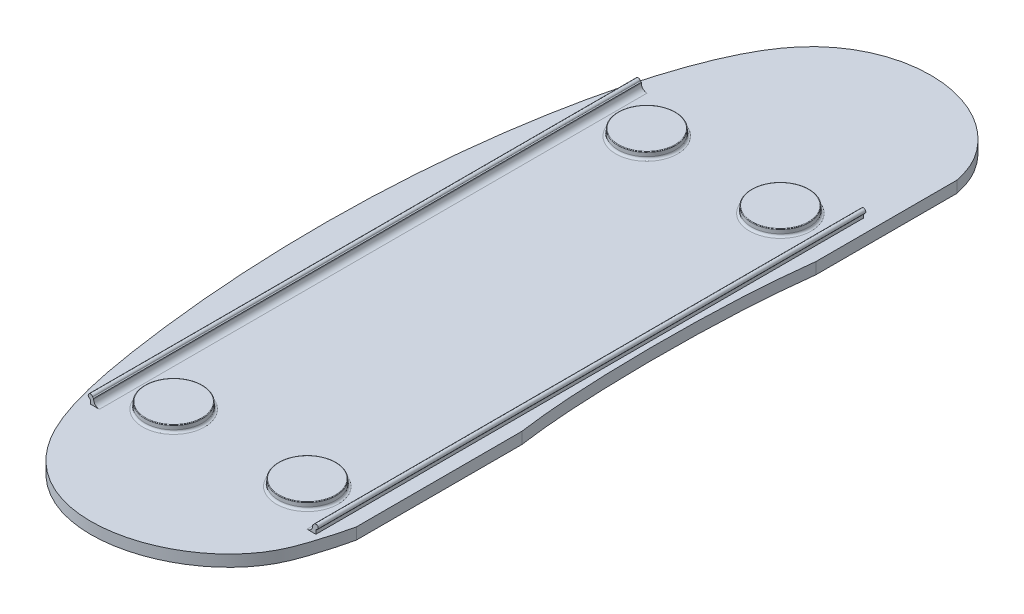
ISO-10303-21;
HEADER;
FILE_DESCRIPTION(('STEP AP214'),'2;1');
FILE_NAME('part.step','',(''),(''),'','','');
FILE_SCHEMA(('AUTOMOTIVE_DESIGN { 1 0 10303 214 1 1 1 1 }'));
ENDSEC;
DATA;
#1=APPLICATION_CONTEXT('core data for automotive mechanical design processes');
#2=APPLICATION_PROTOCOL_DEFINITION('international standard','automotive_design',2000,#1);
#3=PRODUCT_CONTEXT('',#1,'mechanical');
#4=PRODUCT('Part','Part','',(#3));
#5=PRODUCT_RELATED_PRODUCT_CATEGORY('part','',(#4));
#6=PRODUCT_DEFINITION_FORMATION('','',#4);
#7=PRODUCT_DEFINITION_CONTEXT('part definition',#1,'design');
#8=PRODUCT_DEFINITION('design','',#6,#7);
#9=PRODUCT_DEFINITION_SHAPE('','',#8);
#10=(LENGTH_UNIT() NAMED_UNIT(*) SI_UNIT(.MILLI.,.METRE.));
#11=(NAMED_UNIT(*) PLANE_ANGLE_UNIT() SI_UNIT($,.RADIAN.));
#12=(NAMED_UNIT(*) SI_UNIT($,.STERADIAN.) SOLID_ANGLE_UNIT());
#13=UNCERTAINTY_MEASURE_WITH_UNIT(LENGTH_MEASURE(1.E-05),#10,'distance_accuracy_value','');
#14=(GEOMETRIC_REPRESENTATION_CONTEXT(3) GLOBAL_UNCERTAINTY_ASSIGNED_CONTEXT((#13)) GLOBAL_UNIT_ASSIGNED_CONTEXT((#10,
#11,#12)) REPRESENTATION_CONTEXT('',''));
#15=CARTESIAN_POINT('',(0.,0.,0.));
#16=DIRECTION('',(0.,0.,1.));
#17=DIRECTION('',(1.,0.,0.));
#18=AXIS2_PLACEMENT_3D('',#15,#16,#17);
#19=CARTESIAN_POINT('',(-192.253506798672,1.15,-20.0821070412094));
#20=DIRECTION('',(1.,0.,0.));
#21=DIRECTION('',(0.,0.,-1.));
#22=AXIS2_PLACEMENT_3D('',#19,#20,#21);
#23=PLANE('',#22);
#24=DIRECTION('',(0.,1.,0.));
#25=VECTOR('',#24,1.);
#26=CARTESIAN_POINT('',(-192.253506798672,1.15,-19.5821070412094));
#27=LINE('',#26,#25);
#28=CARTESIAN_POINT('',(-192.253506798672,0.,-19.5821070412094));
#29=VERTEX_POINT('',#28);
#30=CARTESIAN_POINT('',(-192.253506798672,0.584314575050781,-19.5821070412094));
#31=VERTEX_POINT('',#30);
#32=EDGE_CURVE('E505',#29,#31,#27,.T.);
#33=ORIENTED_EDGE('',*,*,#32,.F.);
#34=DIRECTION('',(0.,0.,1.));
#35=VECTOR('',#34,1.);
#36=CARTESIAN_POINT('',(-192.253506798672,0.,-20.0821070412094));
#37=LINE('',#36,#35);
#38=CARTESIAN_POINT('',(-192.253506798672,0.,75.9178929587906));
#39=VERTEX_POINT('',#38);
#40=EDGE_CURVE('E266',#29,#39,#37,.T.);
#41=ORIENTED_EDGE('',*,*,#40,.T.);
#42=DIRECTION('',(0.,-1.,0.));
#43=VECTOR('',#42,1.);
#44=CARTESIAN_POINT('',(-192.253506798672,1.15,75.9178929587906));
#45=LINE('',#44,#43);
#46=CARTESIAN_POINT('',(-192.253506798672,0.584314575050781,75.9178929587906));
#47=VERTEX_POINT('',#46);
#48=EDGE_CURVE('E535',#47,#39,#45,.T.);
#49=ORIENTED_EDGE('',*,*,#48,.F.);
#50=DIRECTION('',(0.,0.,-1.));
#51=VECTOR('',#50,1.);
#52=CARTESIAN_POINT('',(-192.253506798672,0.584314575050781,-20.0821070412094));
#53=LINE('',#52,#51);
#54=EDGE_CURVE('E416',#47,#31,#53,.T.);
#55=ORIENTED_EDGE('',*,*,#54,.T.);
#56=EDGE_LOOP('',(#33,#41,#49,#55));
#57=FACE_BOUND('',#56,.T.);
#58=ADVANCED_FACE('F117',(#57),#23,.F.);
#59=CARTESIAN_POINT('',(-152.953506798672,1.15,-20.0821070412094));
#60=DIRECTION('',(-1.,0.,0.));
#61=DIRECTION('',(0.,0.,1.));
#62=AXIS2_PLACEMENT_3D('',#59,#60,#61);
#63=PLANE('',#62);
#64=DIRECTION('',(0.,-1.,0.));
#65=VECTOR('',#64,1.);
#66=CARTESIAN_POINT('',(-152.953506798672,1.15,-19.5821070412094));
#67=LINE('',#66,#65);
#68=CARTESIAN_POINT('',(-152.953506798672,0.584314575050752,-19.5821070412094));
#69=VERTEX_POINT('',#68);
#70=CARTESIAN_POINT('',(-152.953506798672,0.,-19.5821070412094));
#71=VERTEX_POINT('',#70);
#72=EDGE_CURVE('E519',#69,#71,#67,.T.);
#73=ORIENTED_EDGE('',*,*,#72,.F.);
#74=DIRECTION('',(0.,0.,1.));
#75=VECTOR('',#74,1.);
#76=CARTESIAN_POINT('',(-152.953506798672,0.584314575050752,76.4178929587906));
#77=LINE('',#76,#75);
#78=CARTESIAN_POINT('',(-152.953506798672,0.584314575050752,75.9178929587906));
#79=VERTEX_POINT('',#78);
#80=EDGE_CURVE('E258',#69,#79,#77,.T.);
#81=ORIENTED_EDGE('',*,*,#80,.T.);
#82=DIRECTION('',(0.,1.,0.));
#83=VECTOR('',#82,1.);
#84=CARTESIAN_POINT('',(-152.953506798672,1.15,75.9178929587906));
#85=LINE('',#84,#83);
#86=CARTESIAN_POINT('',(-152.953506798672,0.,75.9178929587906));
#87=VERTEX_POINT('',#86);
#88=EDGE_CURVE('E243',#87,#79,#85,.T.);
#89=ORIENTED_EDGE('',*,*,#88,.F.);
#90=DIRECTION('',(0.,0.,-1.));
#91=VECTOR('',#90,1.);
#92=CARTESIAN_POINT('',(-152.953506798672,0.,-20.0821070412094));
#93=LINE('',#92,#91);
#94=EDGE_CURVE('E256',#87,#71,#93,.T.);
#95=ORIENTED_EDGE('',*,*,#94,.T.);
#96=EDGE_LOOP('',(#73,#81,#89,#95));
#97=FACE_BOUND('',#96,.T.);
#98=ADVANCED_FACE('F255',(#97),#63,.F.);
#99=CARTESIAN_POINT('',(-191.703506798672,-103.785789007937,-20.0821070412094));
#100=DIRECTION('',(-1.,0.,0.));
#101=DIRECTION('',(0.,0.,1.));
#102=AXIS2_PLACEMENT_3D('',#99,#100,#101);
#103=PLANE('',#102);
#104=DIRECTION('',(0.,-1.,0.));
#105=VECTOR('',#104,1.);
#106=CARTESIAN_POINT('',(-191.703506798672,-103.785789007937,-19.5821070412094));
#107=LINE('',#106,#105);
#108=CARTESIAN_POINT('',(-191.703506798672,1.15,-19.5821070412094));
#109=VERTEX_POINT('',#108);
#110=CARTESIAN_POINT('',(-191.703506798672,1.,-19.5821070412094));
#111=VERTEX_POINT('',#110);
#112=EDGE_CURVE('E259',#109,#111,#107,.T.);
#113=ORIENTED_EDGE('',*,*,#112,.F.);
#114=DIRECTION('',(0.,0.,1.));
#115=VECTOR('',#114,1.);
#116=CARTESIAN_POINT('',(-191.703506798672,1.15,-20.0821070412094));
#117=LINE('',#116,#115);
#118=CARTESIAN_POINT('',(-191.703506798672,1.15,75.9178929587906));
#119=VERTEX_POINT('',#118);
#120=EDGE_CURVE('E489',#109,#119,#117,.T.);
#121=ORIENTED_EDGE('',*,*,#120,.T.);
#122=DIRECTION('',(0.,1.,0.));
#123=VECTOR('',#122,1.);
#124=CARTESIAN_POINT('',(-191.703506798672,-103.785789007937,75.9178929587906));
#125=LINE('',#124,#123);
#126=CARTESIAN_POINT('',(-191.703506798672,1.,75.9178929587906));
#127=VERTEX_POINT('',#126);
#128=EDGE_CURVE('E480',#127,#119,#125,.T.);
#129=ORIENTED_EDGE('',*,*,#128,.F.);
#130=DIRECTION('',(0.,0.,1.));
#131=VECTOR('',#130,1.);
#132=CARTESIAN_POINT('',(-191.703506798672,1.,-20.0821070412094));
#133=LINE('',#132,#131);
#134=EDGE_CURVE('E474',#127,#111,#133,.F.);
#135=ORIENTED_EDGE('',*,*,#134,.T.);
#136=EDGE_LOOP('',(#113,#121,#129,#135));
#137=FACE_BOUND('',#136,.T.);
#138=ADVANCED_FACE('F371',(#137),#103,.F.);
#139=CARTESIAN_POINT('',(-153.503506798672,-103.785789007937,-20.0821070412094));
#140=DIRECTION('',(-1.,0.,0.));
#141=DIRECTION('',(0.,0.,1.));
#142=AXIS2_PLACEMENT_3D('',#139,#140,#141);
#143=PLANE('',#142);
#144=DIRECTION('',(0.,0.,1.));
#145=VECTOR('',#144,1.);
#146=CARTESIAN_POINT('',(-153.503506798672,1.15,-20.0821070412094));
#147=LINE('',#146,#145);
#148=CARTESIAN_POINT('',(-153.503506798672,1.15,-19.5821070412094));
#149=VERTEX_POINT('',#148);
#150=CARTESIAN_POINT('',(-153.503506798672,1.15,75.9178929587906));
#151=VERTEX_POINT('',#150);
#152=EDGE_CURVE('E272',#149,#151,#147,.T.);
#153=ORIENTED_EDGE('',*,*,#152,.F.);
#154=DIRECTION('',(0.,-1.,0.));
#155=VECTOR('',#154,1.);
#156=CARTESIAN_POINT('',(-153.503506798672,-103.785789007937,-19.5821070412094));
#157=LINE('',#156,#155);
#158=CARTESIAN_POINT('',(-153.503506798672,1.,-19.5821070412094));
#159=VERTEX_POINT('',#158);
#160=EDGE_CURVE('E509',#149,#159,#157,.T.);
#161=ORIENTED_EDGE('',*,*,#160,.T.);
#162=DIRECTION('',(0.,0.,1.));
#163=VECTOR('',#162,1.);
#164=CARTESIAN_POINT('',(-153.503506798672,1.,-20.0821070412094));
#165=LINE('',#164,#163);
#166=CARTESIAN_POINT('',(-153.503506798672,1.,75.9178929587906));
#167=VERTEX_POINT('',#166);
#168=EDGE_CURVE('E467',#159,#167,#165,.T.);
#169=ORIENTED_EDGE('',*,*,#168,.T.);
#170=DIRECTION('',(0.,1.,0.));
#171=VECTOR('',#170,1.);
#172=CARTESIAN_POINT('',(-153.503506798672,-103.785789007937,75.9178929587906));
#173=LINE('',#172,#171);
#174=EDGE_CURVE('E531',#167,#151,#173,.T.);
#175=ORIENTED_EDGE('',*,*,#174,.T.);
#176=EDGE_LOOP('',(#153,#161,#169,#175));
#177=FACE_BOUND('',#176,.T.);
#178=ADVANCED_FACE('F529',(#177),#143,.T.);
#179=CARTESIAN_POINT('',(-152.953506798672,1.15,76.4178929587906));
#180=DIRECTION('',(0.,0.,-1.));
#181=DIRECTION('',(-1.,0.,0.));
#182=AXIS2_PLACEMENT_3D('',#179,#180,#181);
#183=CYLINDRICAL_SURFACE('',#182,0.400000000000011);
#184=CARTESIAN_POINT('',(-152.953506798672,1.15,-19.5821070412094));
#185=DIRECTION('',(0.,0.,-1.));
#186=DIRECTION('',(-1.,0.,0.));
#187=AXIS2_PLACEMENT_3D('',#184,#185,#186);
#188=CIRCLE('',#187,0.400000000000011);
#189=CARTESIAN_POINT('',(-153.330779525945,1.28291083197465,-19.5821070412094));
#190=VERTEX_POINT('',#189);
#191=CARTESIAN_POINT('',(-152.820173465339,0.772876383367158,-19.5821070412094));
#192=VERTEX_POINT('',#191);
#193=EDGE_CURVE('E515',#190,#192,#188,.T.);
#194=ORIENTED_EDGE('',*,*,#193,.F.);
#195=DIRECTION('',(0.,0.,-1.));
#196=VECTOR('',#195,1.);
#197=CARTESIAN_POINT('',(-153.330779525945,1.28291083197466,76.4178929587906));
#198=LINE('',#197,#196);
#199=CARTESIAN_POINT('',(-153.330779525945,1.28291083197465,75.9178929587906));
#200=VERTEX_POINT('',#199);
#201=EDGE_CURVE('E397',#190,#200,#198,.F.);
#202=ORIENTED_EDGE('',*,*,#201,.T.);
#203=CARTESIAN_POINT('',(-152.953506798672,1.15,75.9178929587906));
#204=DIRECTION('',(0.,0.,1.));
#205=DIRECTION('',(1.,0.,0.));
#206=AXIS2_PLACEMENT_3D('',#203,#204,#205);
#207=CIRCLE('',#206,0.400000000000011);
#208=CARTESIAN_POINT('',(-152.820173465339,0.772876383367167,75.9178929587906));
#209=VERTEX_POINT('',#208);
#210=EDGE_CURVE('E533',#209,#200,#207,.T.);
#211=ORIENTED_EDGE('',*,*,#210,.F.);
#212=DIRECTION('',(0.,0.,-1.));
#213=VECTOR('',#212,1.);
#214=CARTESIAN_POINT('',(-152.820173465339,0.772876383367167,76.4178929587906));
#215=LINE('',#214,#213);
#216=EDGE_CURVE('E401',#209,#192,#215,.T.);
#217=ORIENTED_EDGE('',*,*,#216,.T.);
#218=EDGE_LOOP('',(#194,#202,#211,#217));
#219=FACE_BOUND('',#218,.T.);
#220=ADVANCED_FACE('F542',(#219),#183,.T.);
#221=CARTESIAN_POINT('',(-192.253506798672,1.15,76.4178929587906));
#222=DIRECTION('',(0.,0.,1.));
#223=DIRECTION('',(1.,0.,0.));
#224=AXIS2_PLACEMENT_3D('',#221,#222,#223);
#225=CYLINDRICAL_SURFACE('',#224,0.399999999999984);
#226=DIRECTION('',(0.,0.,1.));
#227=VECTOR('',#226,1.);
#228=CARTESIAN_POINT('',(-191.8762340714,1.28291083197467,76.4178929587906));
#229=LINE('',#228,#227);
#230=CARTESIAN_POINT('',(-191.8762340714,1.28291083197468,75.9178929587906));
#231=VERTEX_POINT('',#230);
#232=CARTESIAN_POINT('',(-191.8762340714,1.28291083197467,-19.5821070412094));
#233=VERTEX_POINT('',#232);
#234=EDGE_CURVE('E413',#231,#233,#229,.F.);
#235=ORIENTED_EDGE('',*,*,#234,.T.);
#236=CARTESIAN_POINT('',(-192.253506798672,1.15,-19.5821070412094));
#237=DIRECTION('',(0.,0.,-1.));
#238=DIRECTION('',(-1.,0.,0.));
#239=AXIS2_PLACEMENT_3D('',#236,#237,#238);
#240=CIRCLE('',#239,0.399999999999984);
#241=CARTESIAN_POINT('',(-192.386840132006,0.772876383367197,-19.5821070412094));
#242=VERTEX_POINT('',#241);
#243=EDGE_CURVE('E498',#242,#233,#240,.T.);
#244=ORIENTED_EDGE('',*,*,#243,.F.);
#245=DIRECTION('',(0.,0.,1.));
#246=VECTOR('',#245,1.);
#247=CARTESIAN_POINT('',(-192.386840132006,0.772876383367196,76.4178929587906));
#248=LINE('',#247,#246);
#249=CARTESIAN_POINT('',(-192.386840132006,0.772876383367197,75.9178929587906));
#250=VERTEX_POINT('',#249);
#251=EDGE_CURVE('E410',#242,#250,#248,.T.);
#252=ORIENTED_EDGE('',*,*,#251,.T.);
#253=CARTESIAN_POINT('',(-192.253506798672,1.15,75.9178929587906));
#254=DIRECTION('',(0.,0.,1.));
#255=DIRECTION('',(1.,0.,0.));
#256=AXIS2_PLACEMENT_3D('',#253,#254,#255);
#257=CIRCLE('',#256,0.399999999999984);
#258=EDGE_CURVE('E549',#231,#250,#257,.T.);
#259=ORIENTED_EDGE('',*,*,#258,.F.);
#260=EDGE_LOOP('',(#235,#244,#252,#259));
#261=FACE_BOUND('',#260,.T.);
#262=ADVANCED_FACE('F311',(#261),#225,.T.);
#263=CARTESIAN_POINT('',(-152.753506798672,0.584314575050752,76.4178929587906));
#264=DIRECTION('',(0.,0.,-1.));
#265=DIRECTION('',(-1.,0.,0.));
#266=AXIS2_PLACEMENT_3D('',#263,#264,#265);
#267=CYLINDRICAL_SURFACE('',#266,0.2);
#268=CARTESIAN_POINT('',(-152.753506798672,0.584314575050752,-19.5821070412094));
#269=DIRECTION('',(0.,0.,-1.));
#270=DIRECTION('',(-1.,0.,0.));
#271=AXIS2_PLACEMENT_3D('',#268,#269,#270);
#272=CIRCLE('',#271,0.2);
#273=EDGE_CURVE('E517',#192,#69,#272,.F.);
#274=ORIENTED_EDGE('',*,*,#273,.F.);
#275=ORIENTED_EDGE('',*,*,#216,.F.);
#276=CARTESIAN_POINT('',(-152.753506798672,0.584314575050752,75.9178929587906));
#277=DIRECTION('',(0.,0.,1.));
#278=DIRECTION('',(1.,0.,0.));
#279=AXIS2_PLACEMENT_3D('',#276,#277,#278);
#280=CIRCLE('',#279,0.2);
#281=EDGE_CURVE('E260',#79,#209,#280,.F.);
#282=ORIENTED_EDGE('',*,*,#281,.F.);
#283=ORIENTED_EDGE('',*,*,#80,.F.);
#284=EDGE_LOOP('',(#274,#275,#282,#283));
#285=FACE_BOUND('',#284,.T.);
#286=ADVANCED_FACE('F307',(#285),#267,.F.);
#287=CARTESIAN_POINT('',(-153.519415889582,1.349366247962,76.4178929587906));
#288=DIRECTION('',(0.,0.,1.));
#289=DIRECTION('',(1.,0.,0.));
#290=AXIS2_PLACEMENT_3D('',#287,#288,#289);
#291=CYLINDRICAL_SURFACE('',#290,0.2);
#292=CARTESIAN_POINT('',(-153.519415889582,1.349366247962,-19.5821070412094));
#293=DIRECTION('',(0.,0.,-1.));
#294=DIRECTION('',(-1.,0.,0.));
#295=AXIS2_PLACEMENT_3D('',#292,#293,#294);
#296=CIRCLE('',#295,0.2);
#297=EDGE_CURVE('E512',#149,#190,#296,.F.);
#298=ORIENTED_EDGE('',*,*,#297,.F.);
#299=ORIENTED_EDGE('',*,*,#152,.T.);
#300=CARTESIAN_POINT('',(-153.519415889582,1.349366247962,75.9178929587906));
#301=DIRECTION('',(0.,0.,1.));
#302=DIRECTION('',(1.,0.,0.));
#303=AXIS2_PLACEMENT_3D('',#300,#301,#302);
#304=CIRCLE('',#303,0.2);
#305=EDGE_CURVE('E526',#200,#151,#304,.F.);
#306=ORIENTED_EDGE('',*,*,#305,.F.);
#307=ORIENTED_EDGE('',*,*,#201,.F.);
#308=EDGE_LOOP('',(#298,#299,#306,#307));
#309=FACE_BOUND('',#308,.T.);
#310=ADVANCED_FACE('F310',(#309),#291,.F.);
#311=CARTESIAN_POINT('',(-191.687597707763,1.349366247962,76.4178929587906));
#312=DIRECTION('',(0.,0.,-1.));
#313=DIRECTION('',(-1.,0.,0.));
#314=AXIS2_PLACEMENT_3D('',#311,#312,#313);
#315=CYLINDRICAL_SURFACE('',#314,0.2);
#316=CARTESIAN_POINT('',(-191.687597707763,1.349366247962,-19.5821070412094));
#317=DIRECTION('',(0.,0.,-1.));
#318=DIRECTION('',(-1.,0.,0.));
#319=AXIS2_PLACEMENT_3D('',#316,#317,#318);
#320=CIRCLE('',#319,0.2);
#321=EDGE_CURVE('E496',#233,#109,#320,.F.);
#322=ORIENTED_EDGE('',*,*,#321,.F.);
#323=ORIENTED_EDGE('',*,*,#234,.F.);
#324=CARTESIAN_POINT('',(-191.687597707763,1.349366247962,75.9178929587906));
#325=DIRECTION('',(0.,0.,1.));
#326=DIRECTION('',(1.,0.,0.));
#327=AXIS2_PLACEMENT_3D('',#324,#325,#326);
#328=CIRCLE('',#327,0.2);
#329=EDGE_CURVE('E490',#119,#231,#328,.F.);
#330=ORIENTED_EDGE('',*,*,#329,.F.);
#331=ORIENTED_EDGE('',*,*,#120,.F.);
#332=EDGE_LOOP('',(#322,#323,#330,#331));
#333=FACE_BOUND('',#332,.T.);
#334=ADVANCED_FACE('F315',(#333),#315,.F.);
#335=CARTESIAN_POINT('',(-192.453506798672,0.584314575050781,76.4178929587906));
#336=DIRECTION('',(0.,0.,1.));
#337=DIRECTION('',(1.,0.,0.));
#338=AXIS2_PLACEMENT_3D('',#335,#336,#337);
#339=CYLINDRICAL_SURFACE('',#338,0.2);
#340=CARTESIAN_POINT('',(-192.453506798672,0.584314575050781,-19.5821070412094));
#341=DIRECTION('',(0.,0.,-1.));
#342=DIRECTION('',(-1.,0.,0.));
#343=AXIS2_PLACEMENT_3D('',#340,#341,#342);
#344=CIRCLE('',#343,0.2);
#345=EDGE_CURVE('E503',#31,#242,#344,.F.);
#346=ORIENTED_EDGE('',*,*,#345,.F.);
#347=ORIENTED_EDGE('',*,*,#54,.F.);
#348=CARTESIAN_POINT('',(-192.453506798672,0.584314575050781,75.9178929587906));
#349=DIRECTION('',(0.,0.,1.));
#350=DIRECTION('',(1.,0.,0.));
#351=AXIS2_PLACEMENT_3D('',#348,#349,#350);
#352=CIRCLE('',#351,0.2);
#353=EDGE_CURVE('E551',#250,#47,#352,.F.);
#354=ORIENTED_EDGE('',*,*,#353,.F.);
#355=ORIENTED_EDGE('',*,*,#251,.F.);
#356=EDGE_LOOP('',(#346,#347,#354,#355));
#357=FACE_BOUND('',#356,.T.);
#358=ADVANCED_FACE('F319',(#357),#339,.F.);
#359=CARTESIAN_POINT('',(-154.503506798672,1.,-20.0821070412094));
#360=DIRECTION('',(0.,0.,1.));
#361=DIRECTION('',(1.,0.,0.));
#362=AXIS2_PLACEMENT_3D('',#359,#360,#361);
#363=CYLINDRICAL_SURFACE('',#362,1.);
#364=CARTESIAN_POINT('',(-154.503506798672,1.,-19.5821070412094));
#365=DIRECTION('',(0.,0.,-1.));
#366=DIRECTION('',(-1.,0.,0.));
#367=AXIS2_PLACEMENT_3D('',#364,#365,#366);
#368=CIRCLE('',#367,1.);
#369=CARTESIAN_POINT('',(-154.503506798672,0.,-19.5821070412094));
#370=VERTEX_POINT('',#369);
#371=EDGE_CURVE('E507',#370,#159,#368,.F.);
#372=ORIENTED_EDGE('',*,*,#371,.F.);
#373=DIRECTION('',(0.,0.,1.));
#374=VECTOR('',#373,1.);
#375=CARTESIAN_POINT('',(-154.503506798672,0.,0.));
#376=LINE('',#375,#374);
#377=CARTESIAN_POINT('',(-154.503506798672,0.,75.9178929587906));
#378=VERTEX_POINT('',#377);
#379=EDGE_CURVE('E472',#378,#370,#376,.F.);
#380=ORIENTED_EDGE('',*,*,#379,.F.);
#381=CARTESIAN_POINT('',(-154.503506798672,1.,75.9178929587906));
#382=DIRECTION('',(0.,0.,1.));
#383=DIRECTION('',(1.,0.,0.));
#384=AXIS2_PLACEMENT_3D('',#381,#382,#383);
#385=CIRCLE('',#384,1.);
#386=EDGE_CURVE('E246',#167,#378,#385,.F.);
#387=ORIENTED_EDGE('',*,*,#386,.F.);
#388=ORIENTED_EDGE('',*,*,#168,.F.);
#389=EDGE_LOOP('',(#372,#380,#387,#388));
#390=FACE_BOUND('',#389,.T.);
#391=ADVANCED_FACE('F323',(#390),#363,.F.);
#392=CARTESIAN_POINT('',(-190.703506798672,1.,0.));
#393=DIRECTION('',(0.,0.,-1.));
#394=DIRECTION('',(-1.,0.,0.));
#395=AXIS2_PLACEMENT_3D('',#392,#393,#394);
#396=CYLINDRICAL_SURFACE('',#395,1.);
#397=CARTESIAN_POINT('',(-190.703506798672,1.,-19.5821070412094));
#398=DIRECTION('',(0.,0.,-1.));
#399=DIRECTION('',(-1.,0.,0.));
#400=AXIS2_PLACEMENT_3D('',#397,#398,#399);
#401=CIRCLE('',#400,1.);
#402=CARTESIAN_POINT('',(-190.703506798672,0.,-19.5821070412094));
#403=VERTEX_POINT('',#402);
#404=EDGE_CURVE('E12',#111,#403,#401,.F.);
#405=ORIENTED_EDGE('',*,*,#404,.F.);
#406=ORIENTED_EDGE('',*,*,#134,.F.);
#407=CARTESIAN_POINT('',(-190.703506798672,1.,75.9178929587906));
#408=DIRECTION('',(0.,0.,1.));
#409=DIRECTION('',(1.,0.,0.));
#410=AXIS2_PLACEMENT_3D('',#407,#408,#409);
#411=CIRCLE('',#410,1.);
#412=CARTESIAN_POINT('',(-190.703506798672,0.,75.9178929587906));
#413=VERTEX_POINT('',#412);
#414=EDGE_CURVE('E125',#413,#127,#411,.F.);
#415=ORIENTED_EDGE('',*,*,#414,.F.);
#416=DIRECTION('',(0.,0.,1.));
#417=VECTOR('',#416,1.);
#418=CARTESIAN_POINT('',(-190.703506798672,0.,76.4178929587906));
#419=LINE('',#418,#417);
#420=EDGE_CURVE('E470',#403,#413,#419,.T.);
#421=ORIENTED_EDGE('',*,*,#420,.F.);
#422=EDGE_LOOP('',(#405,#406,#415,#421));
#423=FACE_BOUND('',#422,.T.);
#424=ADVANCED_FACE('F119',(#423),#396,.F.);
#425=CARTESIAN_POINT('',(0.,0.,0.));
#426=DIRECTION('',(0.,-1.,0.));
#427=DIRECTION('',(0.,0.,-1.));
#428=AXIS2_PLACEMENT_3D('',#425,#426,#427);
#429=PLANE('',#428);
#430=ORIENTED_EDGE('',*,*,#40,.F.);
#431=DIRECTION('',(1.,0.,0.));
#432=VECTOR('',#431,1.);
#433=CARTESIAN_POINT('',(-192.653506798672,0.,-19.5821070412094));
#434=LINE('',#433,#432);
#435=EDGE_CURVE('E140',#29,#403,#434,.T.);
#436=ORIENTED_EDGE('',*,*,#435,.T.);
#437=ORIENTED_EDGE('',*,*,#420,.T.);
#438=DIRECTION('',(-1.,0.,0.));
#439=VECTOR('',#438,1.);
#440=CARTESIAN_POINT('',(-152.553506798672,0.,75.9178929587906));
#441=LINE('',#440,#439);
#442=EDGE_CURVE('E249',#413,#39,#441,.T.);
#443=ORIENTED_EDGE('',*,*,#442,.T.);
#444=EDGE_LOOP('',(#430,#436,#437,#443));
#445=FACE_BOUND('',#444,.T.);
#446=ORIENTED_EDGE('',*,*,#94,.F.);
#447=EDGE_CURVE('E132',#87,#378,#441,.T.);
#448=ORIENTED_EDGE('',*,*,#447,.T.);
#449=ORIENTED_EDGE('',*,*,#379,.T.);
#450=EDGE_CURVE('E248',#370,#71,#434,.T.);
#451=ORIENTED_EDGE('',*,*,#450,.T.);
#452=EDGE_LOOP('',(#446,#448,#449,#451));
#453=FACE_BOUND('',#452,.T.);
#454=DIRECTION('',(0.,0.,1.));
#455=VECTOR('',#454,1.);
#456=CARTESIAN_POINT('',(-150.543506798672,0.,0.));
#457=LINE('',#456,#455);
#458=CARTESIAN_POINT('',(-150.543506798672,0.,42.4221344366589));
#459=VERTEX_POINT('',#458);
#460=CARTESIAN_POINT('',(-150.543506798672,0.,71.2812308740238));
#461=VERTEX_POINT('',#460);
#462=EDGE_CURVE('E265',#459,#461,#457,.T.);
#463=ORIENTED_EDGE('',*,*,#462,.F.);
#464=CARTESIAN_POINT('',(-150.543506798672,0.,42.4221344366589));
#465=CARTESIAN_POINT('',(-149.87356577608,0.,48.1140128894975));
#466=CARTESIAN_POINT('',(-148.278546710452,0.,63.9626210010931));
#467=CARTESIAN_POINT('',(-151.853536774706,0.,76.2414544995898));
#468=CARTESIAN_POINT('',(-157.159821335867,0.,93.1301695319022));
#469=CARTESIAN_POINT('',(-189.449961988125,0.,102.027699126461));
#470=CARTESIAN_POINT('',(-203.492044916193,0.,30.0657144599285));
#471=CARTESIAN_POINT('',(-196.078968692878,0.,-21.8132718738506));
#472=CARTESIAN_POINT('',(-179.12954818703,0.,-49.342726570093));
#473=CARTESIAN_POINT('',(-159.828165808346,0.,-48.9223362720737));
#474=CARTESIAN_POINT('',(-151.707122140152,0.,-37.5608181876024));
#475=CARTESIAN_POINT('',(-150.628141150404,0.,-34.0922077096906));
#476=CARTESIAN_POINT('',(-149.005776309877,0.,-25.5043753827882));
#477=CARTESIAN_POINT('',(-149.753495962378,0.,-15.3590020513309));
#478=CARTESIAN_POINT('',(-152.504186571276,0.,7.27371901696906));
#479=CARTESIAN_POINT('',(-151.994040872551,0.,31.6859631096172));
#480=CARTESIAN_POINT('',(-150.744518549863,0.,40.7143207384556));
#481=CARTESIAN_POINT('',(-150.543506798672,0.,42.4221344366589));
#482=B_SPLINE_CURVE_WITH_KNOTS('',3,(#464,#465,#466,#467,#468,#469,#470,#471,#472,#473,#474,
#475,#476,#477,#478,#479,#480,#481),.UNSPECIFIED.,.T.,.F.,(4,1,1,1,1,1,1,1,1,1,1,1,1,1,1,4),(0.,
0.077011586370835,0.0902811537206076,0.105290010403906,0.213565692892721,0.249846177996582,
0.43181437633865,0.473017713532991,0.620676212745646,0.641064732595728,0.656514392183728,
0.669494179040439,0.757882814306125,0.792038254342903,0.976893139371433,0.999999999999999),.UNSPECIFIED.);
#483=CARTESIAN_POINT('',(-150.543506798672,0.,-8.92432629280241));
#484=VERTEX_POINT('',#483);
#485=EDGE_CURVE('E280',#484,#459,#482,.T.);
#486=ORIENTED_EDGE('',*,*,#485,.F.);
#487=DIRECTION('',(0.,0.,-1.));
#488=VECTOR('',#487,1.);
#489=CARTESIAN_POINT('',(-150.543506798672,0.,0.));
#490=LINE('',#489,#488);
#491=CARTESIAN_POINT('',(-150.543506798672,0.,-33.4757120400574));
#492=VERTEX_POINT('',#491);
#493=EDGE_CURVE('E820',#484,#492,#490,.T.);
#494=ORIENTED_EDGE('',*,*,#493,.T.);
#495=EDGE_CURVE('E269',#461,#492,#482,.T.);
#496=ORIENTED_EDGE('',*,*,#495,.F.);
#497=EDGE_LOOP('',(#463,#486,#494,#496));
#498=FACE_BOUND('',#497,.T.);
#499=CARTESIAN_POINT('',(-160.953506798672,0.,-13.0821070412094));
#500=DIRECTION('',(0.,-1.,0.));
#501=DIRECTION('',(0.,0.,-1.));
#502=AXIS2_PLACEMENT_3D('',#499,#500,#501);
#503=CIRCLE('',#502,5.39999999999999);
#504=CARTESIAN_POINT('',(-160.953506798672,0.,-18.4821070412094));
#505=VERTEX_POINT('',#504);
#506=EDGE_CURVE('E443',#505,#505,#503,.T.);
#507=ORIENTED_EDGE('',*,*,#506,.T.);
#508=EDGE_LOOP('',(#507));
#509=FACE_BOUND('',#508,.T.);
#510=CARTESIAN_POINT('',(-184.253506798672,0.,-13.0821070412094));
#511=DIRECTION('',(0.,-1.,0.));
#512=DIRECTION('',(0.,0.,-1.));
#513=AXIS2_PLACEMENT_3D('',#510,#511,#512);
#514=CIRCLE('',#513,5.39999999999999);
#515=CARTESIAN_POINT('',(-184.253506798672,0.,-18.4821070412094));
#516=VERTEX_POINT('',#515);
#517=EDGE_CURVE('E446',#516,#516,#514,.T.);
#518=ORIENTED_EDGE('',*,*,#517,.T.);
#519=EDGE_LOOP('',(#518));
#520=FACE_BOUND('',#519,.T.);
#521=CARTESIAN_POINT('',(-160.953506798672,0.,69.4178929587906));
#522=DIRECTION('',(0.,-1.,0.));
#523=DIRECTION('',(0.,0.,-1.));
#524=AXIS2_PLACEMENT_3D('',#521,#522,#523);
#525=CIRCLE('',#524,5.39999999999999);
#526=CARTESIAN_POINT('',(-160.953506798672,0.,64.0178929587907));
#527=VERTEX_POINT('',#526);
#528=EDGE_CURVE('E449',#527,#527,#525,.T.);
#529=ORIENTED_EDGE('',*,*,#528,.T.);
#530=EDGE_LOOP('',(#529));
#531=FACE_BOUND('',#530,.T.);
#532=CARTESIAN_POINT('',(-184.253506798672,0.,69.4178929587906));
#533=DIRECTION('',(0.,-1.,0.));
#534=DIRECTION('',(0.,0.,-1.));
#535=AXIS2_PLACEMENT_3D('',#532,#533,#534);
#536=CIRCLE('',#535,5.39999999999999);
#537=CARTESIAN_POINT('',(-184.253506798672,0.,64.0178929587907));
#538=VERTEX_POINT('',#537);
#539=EDGE_CURVE('E452',#538,#538,#536,.T.);
#540=ORIENTED_EDGE('',*,*,#539,.T.);
#541=EDGE_LOOP('',(#540));
#542=FACE_BOUND('',#541,.T.);
#543=ADVANCED_FACE('F263',(#445,#453,#498,#509,#520,#531,#542),#429,.F.);
#544=CARTESIAN_POINT('',(-150.543506798672,-2.,0.));
#545=DIRECTION('',(-1.,0.,0.));
#546=DIRECTION('',(0.,0.,1.));
#547=AXIS2_PLACEMENT_3D('',#544,#545,#546);
#548=PLANE('',#547);
#549=ORIENTED_EDGE('',*,*,#462,.T.);
#550=DIRECTION('',(0.,1.,0.));
#551=VECTOR('',#550,1.);
#552=CARTESIAN_POINT('',(-150.543506798672,-2.,71.2812308740238));
#553=LINE('',#552,#551);
#554=CARTESIAN_POINT('',(-150.543506798672,-2.,71.2812308740238));
#555=VERTEX_POINT('',#554);
#556=EDGE_CURVE('E393',#555,#461,#553,.T.);
#557=ORIENTED_EDGE('',*,*,#556,.F.);
#558=DIRECTION('',(0.,0.,1.));
#559=VECTOR('',#558,1.);
#560=CARTESIAN_POINT('',(-150.543506798672,-2.,0.));
#561=LINE('',#560,#559);
#562=CARTESIAN_POINT('',(-150.543506798672,-2.,42.4221344366589));
#563=VERTEX_POINT('',#562);
#564=EDGE_CURVE('E276',#563,#555,#561,.T.);
#565=ORIENTED_EDGE('',*,*,#564,.F.);
#566=DIRECTION('',(0.,1.,0.));
#567=VECTOR('',#566,1.);
#568=CARTESIAN_POINT('',(-150.543506798672,-2.,42.4221344366589));
#569=LINE('',#568,#567);
#570=EDGE_CURVE('E829',#563,#459,#569,.T.);
#571=ORIENTED_EDGE('',*,*,#570,.T.);
#572=EDGE_LOOP('',(#549,#557,#565,#571));
#573=FACE_BOUND('',#572,.T.);
#574=ADVANCED_FACE('F303',(#573),#548,.F.);
#575=CARTESIAN_POINT('',(-150.543506798672,-2.,42.4221344366589));
#576=CARTESIAN_POINT('',(-149.87356577608,-2.,48.1140128894975));
#577=CARTESIAN_POINT('',(-148.278546710452,-2.,63.9626210010931));
#578=CARTESIAN_POINT('',(-151.853536774706,-2.,76.2414544995898));
#579=CARTESIAN_POINT('',(-157.159821335867,-2.,93.1301695319022));
#580=CARTESIAN_POINT('',(-189.449961988125,-2.,102.027699126461));
#581=CARTESIAN_POINT('',(-203.492044916193,-2.,30.0657144599285));
#582=CARTESIAN_POINT('',(-196.078968692878,-2.,-21.8132718738506));
#583=CARTESIAN_POINT('',(-179.12954818703,-2.,-49.342726570093));
#584=CARTESIAN_POINT('',(-159.828165808346,-2.,-48.9223362720737));
#585=CARTESIAN_POINT('',(-151.707122140152,-2.,-37.5608181876024));
#586=CARTESIAN_POINT('',(-150.628141150404,-2.,-34.0922077096906));
#587=CARTESIAN_POINT('',(-149.005776309877,-2.,-25.5043753827882));
#588=CARTESIAN_POINT('',(-149.753495962378,-2.,-15.3590020513309));
#589=CARTESIAN_POINT('',(-152.504186571276,-2.,7.27371901696906));
#590=CARTESIAN_POINT('',(-151.994040872551,-2.,31.6859631096172));
#591=CARTESIAN_POINT('',(-150.744518549863,-2.,40.7143207384556));
#592=CARTESIAN_POINT('',(-150.543506798672,-2.,42.4221344366589));
#593=B_SPLINE_CURVE_WITH_KNOTS('',3,(#575,#576,#577,#578,#579,#580,#581,#582,#583,#584,#585,
#586,#587,#588,#589,#590,#591,#592),.UNSPECIFIED.,.T.,.F.,(4,1,1,1,1,1,1,1,1,1,1,1,1,1,1,4),(0.,
0.077011586370835,0.0902811537206076,0.105290010403906,0.213565692892721,0.249846177996582,
0.43181437633865,0.473017713532991,0.620676212745646,0.641064732595728,0.656514392183728,
0.669494179040439,0.757882814306125,0.792038254342903,0.976893139371433,0.999999999999999),.UNSPECIFIED.);
#594=DIRECTION('',(0.,1.,0.));
#595=VECTOR('',#594,1.);
#596=SURFACE_OF_LINEAR_EXTRUSION('',#593,#595);
#597=ORIENTED_EDGE('',*,*,#495,.T.);
#598=DIRECTION('',(0.,1.,0.));
#599=VECTOR('',#598,1.);
#600=CARTESIAN_POINT('',(-150.543506798672,-2.,-33.4757120400574));
#601=LINE('',#600,#599);
#602=CARTESIAN_POINT('',(-150.543506798672,-2.,-33.4757120400574));
#603=VERTEX_POINT('',#602);
#604=EDGE_CURVE('E398',#603,#492,#601,.T.);
#605=ORIENTED_EDGE('',*,*,#604,.F.);
#606=EDGE_CURVE('E279',#555,#603,#593,.T.);
#607=ORIENTED_EDGE('',*,*,#606,.F.);
#608=ORIENTED_EDGE('',*,*,#556,.T.);
#609=EDGE_LOOP('',(#597,#605,#607,#608));
#610=FACE_BOUND('',#609,.T.);
#611=ADVANCED_FACE('F298',(#610),#596,.F.);
#612=CARTESIAN_POINT('',(-150.543506798672,-2.,0.));
#613=DIRECTION('',(1.,0.,0.));
#614=DIRECTION('',(0.,0.,-1.));
#615=AXIS2_PLACEMENT_3D('',#612,#613,#614);
#616=PLANE('',#615);
#617=ORIENTED_EDGE('',*,*,#493,.F.);
#618=DIRECTION('',(0.,1.,0.));
#619=VECTOR('',#618,1.);
#620=CARTESIAN_POINT('',(-150.543506798672,-2.,-8.92432629280241));
#621=LINE('',#620,#619);
#622=CARTESIAN_POINT('',(-150.543506798672,-2.,-8.92432629280241));
#623=VERTEX_POINT('',#622);
#624=EDGE_CURVE('E403',#623,#484,#621,.T.);
#625=ORIENTED_EDGE('',*,*,#624,.F.);
#626=DIRECTION('',(0.,0.,-1.));
#627=VECTOR('',#626,1.);
#628=CARTESIAN_POINT('',(-150.543506798672,-2.,0.));
#629=LINE('',#628,#627);
#630=EDGE_CURVE('E285',#623,#603,#629,.T.);
#631=ORIENTED_EDGE('',*,*,#630,.T.);
#632=ORIENTED_EDGE('',*,*,#604,.T.);
#633=EDGE_LOOP('',(#617,#625,#631,#632));
#634=FACE_BOUND('',#633,.T.);
#635=ADVANCED_FACE('F296',(#634),#616,.T.);
#636=ORIENTED_EDGE('',*,*,#485,.T.);
#637=ORIENTED_EDGE('',*,*,#570,.F.);
#638=EDGE_CURVE('E286',#623,#563,#593,.T.);
#639=ORIENTED_EDGE('',*,*,#638,.F.);
#640=ORIENTED_EDGE('',*,*,#624,.T.);
#641=EDGE_LOOP('',(#636,#637,#639,#640));
#642=FACE_BOUND('',#641,.T.);
#643=ADVANCED_FACE('F291',(#642),#596,.F.);
#644=CARTESIAN_POINT('',(0.,-2.,0.));
#645=DIRECTION('',(0.,-1.,0.));
#646=DIRECTION('',(0.,0.,-1.));
#647=AXIS2_PLACEMENT_3D('',#644,#645,#646);
#648=PLANE('',#647);
#649=ORIENTED_EDGE('',*,*,#564,.T.);
#650=ORIENTED_EDGE('',*,*,#606,.T.);
#651=ORIENTED_EDGE('',*,*,#630,.F.);
#652=ORIENTED_EDGE('',*,*,#638,.T.);
#653=EDGE_LOOP('',(#649,#650,#651,#652));
#654=FACE_BOUND('',#653,.T.);
#655=ADVANCED_FACE('F295',(#654),#648,.T.);
#656=CARTESIAN_POINT('',(-160.953506798672,-103.785789007937,69.4178929587906));
#657=DIRECTION('',(0.,1.,0.));
#658=DIRECTION('',(0.,0.,1.));
#659=AXIS2_PLACEMENT_3D('',#656,#657,#658);
#660=CYLINDRICAL_SURFACE('',#659,4.99999999999999);
#661=CARTESIAN_POINT('',(-160.953506798672,0.399999999999998,69.4178929587906));
#662=DIRECTION('',(0.,-1.,0.));
#663=DIRECTION('',(0.,0.,-1.));
#664=AXIS2_PLACEMENT_3D('',#661,#662,#663);
#665=CIRCLE('',#664,4.99999999999999);
#666=CARTESIAN_POINT('',(-160.953506798672,0.399999999999998,64.4178929587906));
#667=VERTEX_POINT('',#666);
#668=EDGE_CURVE('E458',#667,#667,#665,.F.);
#669=ORIENTED_EDGE('',*,*,#668,.T.);
#670=EDGE_LOOP('',(#669));
#671=FACE_BOUND('',#670,.T.);
#672=CARTESIAN_POINT('',(-160.953506798672,1.05,69.4178929587906));
#673=DIRECTION('',(0.,1.,0.));
#674=DIRECTION('',(0.,0.,1.));
#675=AXIS2_PLACEMENT_3D('',#672,#673,#674);
#676=CIRCLE('',#675,4.99999999999999);
#677=CARTESIAN_POINT('',(-160.953506798672,1.05,74.4178929587906));
#678=VERTEX_POINT('',#677);
#679=EDGE_CURVE('E434',#678,#678,#676,.F.);
#680=ORIENTED_EDGE('',*,*,#679,.T.);
#681=EDGE_LOOP('',(#680));
#682=FACE_BOUND('',#681,.T.);
#683=ADVANCED_FACE('F376',(#671,#682),#660,.T.);
#684=CARTESIAN_POINT('',(-184.253506798672,-103.785789007937,-13.0821070412094));
#685=DIRECTION('',(0.,1.,0.));
#686=DIRECTION('',(0.,0.,1.));
#687=AXIS2_PLACEMENT_3D('',#684,#685,#686);
#688=CYLINDRICAL_SURFACE('',#687,4.99999999999999);
#689=CARTESIAN_POINT('',(-184.253506798672,0.399999999999998,-13.0821070412094));
#690=DIRECTION('',(0.,-1.,0.));
#691=DIRECTION('',(0.,0.,-1.));
#692=AXIS2_PLACEMENT_3D('',#689,#690,#691);
#693=CIRCLE('',#692,4.99999999999999);
#694=CARTESIAN_POINT('',(-184.253506798672,0.399999999999998,-18.0821070412094));
#695=VERTEX_POINT('',#694);
#696=EDGE_CURVE('E461',#695,#695,#693,.F.);
#697=ORIENTED_EDGE('',*,*,#696,.T.);
#698=EDGE_LOOP('',(#697));
#699=FACE_BOUND('',#698,.T.);
#700=CARTESIAN_POINT('',(-184.253506798672,1.05,-13.0821070412094));
#701=DIRECTION('',(0.,1.,0.));
#702=DIRECTION('',(0.,0.,1.));
#703=AXIS2_PLACEMENT_3D('',#700,#701,#702);
#704=CIRCLE('',#703,4.99999999999999);
#705=CARTESIAN_POINT('',(-184.253506798672,1.05,-8.08210704120938));
#706=VERTEX_POINT('',#705);
#707=EDGE_CURVE('E422',#706,#706,#704,.F.);
#708=ORIENTED_EDGE('',*,*,#707,.T.);
#709=EDGE_LOOP('',(#708));
#710=FACE_BOUND('',#709,.T.);
#711=ADVANCED_FACE('F382',(#699,#710),#688,.T.);
#712=CARTESIAN_POINT('',(-160.953506798672,-103.785789007937,-13.0821070412094));
#713=DIRECTION('',(0.,1.,0.));
#714=DIRECTION('',(0.,0.,1.));
#715=AXIS2_PLACEMENT_3D('',#712,#713,#714);
#716=CYLINDRICAL_SURFACE('',#715,4.99999999999999);
#717=CARTESIAN_POINT('',(-160.953506798672,0.399999999999998,-13.0821070412094));
#718=DIRECTION('',(0.,-1.,0.));
#719=DIRECTION('',(0.,0.,-1.));
#720=AXIS2_PLACEMENT_3D('',#717,#718,#719);
#721=CIRCLE('',#720,4.99999999999999);
#722=CARTESIAN_POINT('',(-160.953506798672,0.399999999999998,-18.0821070412094));
#723=VERTEX_POINT('',#722);
#724=EDGE_CURVE('E464',#723,#723,#721,.F.);
#725=ORIENTED_EDGE('',*,*,#724,.T.);
#726=EDGE_LOOP('',(#725));
#727=FACE_BOUND('',#726,.T.);
#728=CARTESIAN_POINT('',(-160.953506798672,1.05,-13.0821070412094));
#729=DIRECTION('',(0.,1.,0.));
#730=DIRECTION('',(0.,0.,1.));
#731=AXIS2_PLACEMENT_3D('',#728,#729,#730);
#732=CIRCLE('',#731,4.99999999999999);
#733=CARTESIAN_POINT('',(-160.953506798672,1.05,-8.08210704120939));
#734=VERTEX_POINT('',#733);
#735=EDGE_CURVE('E425',#734,#734,#732,.F.);
#736=ORIENTED_EDGE('',*,*,#735,.T.);
#737=EDGE_LOOP('',(#736));
#738=FACE_BOUND('',#737,.T.);
#739=ADVANCED_FACE('F572',(#727,#738),#716,.T.);
#740=CARTESIAN_POINT('',(-184.253506798672,-103.785789007937,69.4178929587906));
#741=DIRECTION('',(0.,1.,0.));
#742=DIRECTION('',(0.,0.,1.));
#743=AXIS2_PLACEMENT_3D('',#740,#741,#742);
#744=CYLINDRICAL_SURFACE('',#743,4.99999999999999);
#745=CARTESIAN_POINT('',(-184.253506798672,0.399999999999998,69.4178929587906));
#746=DIRECTION('',(0.,-1.,0.));
#747=DIRECTION('',(0.,0.,-1.));
#748=AXIS2_PLACEMENT_3D('',#745,#746,#747);
#749=CIRCLE('',#748,4.99999999999999);
#750=CARTESIAN_POINT('',(-184.253506798672,0.399999999999998,64.4178929587906));
#751=VERTEX_POINT('',#750);
#752=EDGE_CURVE('E455',#751,#751,#749,.F.);
#753=ORIENTED_EDGE('',*,*,#752,.T.);
#754=EDGE_LOOP('',(#753));
#755=FACE_BOUND('',#754,.T.);
#756=CARTESIAN_POINT('',(-184.253506798672,1.05,69.4178929587906));
#757=DIRECTION('',(0.,1.,0.));
#758=DIRECTION('',(0.,0.,1.));
#759=AXIS2_PLACEMENT_3D('',#756,#757,#758);
#760=CIRCLE('',#759,4.99999999999999);
#761=CARTESIAN_POINT('',(-184.253506798672,1.05,74.4178929587906));
#762=VERTEX_POINT('',#761);
#763=EDGE_CURVE('E437',#762,#762,#760,.F.);
#764=ORIENTED_EDGE('',*,*,#763,.T.);
#765=EDGE_LOOP('',(#764));
#766=FACE_BOUND('',#765,.T.);
#767=ADVANCED_FACE('F569',(#755,#766),#744,.T.);
#768=CARTESIAN_POINT('',(0.,1.15,0.));
#769=DIRECTION('',(0.,1.,0.));
#770=DIRECTION('',(0.,0.,1.));
#771=AXIS2_PLACEMENT_3D('',#768,#769,#770);
#772=PLANE('',#771);
#773=CARTESIAN_POINT('',(-160.953506798672,1.15,-13.0821070412094));
#774=DIRECTION('',(0.,1.,0.));
#775=DIRECTION('',(0.,0.,1.));
#776=AXIS2_PLACEMENT_3D('',#773,#774,#775);
#777=CIRCLE('',#776,4.89999999999999);
#778=CARTESIAN_POINT('',(-160.953506798672,1.15,-8.18210704120939));
#779=VERTEX_POINT('',#778);
#780=EDGE_CURVE('E428',#779,#779,#777,.T.);
#781=ORIENTED_EDGE('',*,*,#780,.T.);
#782=EDGE_LOOP('',(#781));
#783=FACE_BOUND('',#782,.T.);
#784=ADVANCED_FACE('F571',(#783),#772,.T.);
#785=CARTESIAN_POINT('',(-184.253506798672,1.15,-13.0821070412094));
#786=DIRECTION('',(0.,1.,0.));
#787=DIRECTION('',(0.,0.,1.));
#788=AXIS2_PLACEMENT_3D('',#785,#786,#787);
#789=CIRCLE('',#788,4.89999999999999);
#790=CARTESIAN_POINT('',(-184.253506798672,1.15,-8.18210704120938));
#791=VERTEX_POINT('',#790);
#792=EDGE_CURVE('E419',#791,#791,#789,.T.);
#793=ORIENTED_EDGE('',*,*,#792,.T.);
#794=EDGE_LOOP('',(#793));
#795=FACE_BOUND('',#794,.T.);
#796=ADVANCED_FACE('F584',(#795),#772,.T.);
#797=CARTESIAN_POINT('',(-160.953506798672,1.15,69.4178929587906));
#798=DIRECTION('',(0.,1.,0.));
#799=DIRECTION('',(0.,0.,1.));
#800=AXIS2_PLACEMENT_3D('',#797,#798,#799);
#801=CIRCLE('',#800,4.89999999999999);
#802=CARTESIAN_POINT('',(-160.953506798672,1.15,74.3178929587906));
#803=VERTEX_POINT('',#802);
#804=EDGE_CURVE('E431',#803,#803,#801,.T.);
#805=ORIENTED_EDGE('',*,*,#804,.T.);
#806=EDGE_LOOP('',(#805));
#807=FACE_BOUND('',#806,.T.);
#808=ADVANCED_FACE('F586',(#807),#772,.T.);
#809=CARTESIAN_POINT('',(-184.253506798672,1.15,69.4178929587906));
#810=DIRECTION('',(0.,1.,0.));
#811=DIRECTION('',(0.,0.,1.));
#812=AXIS2_PLACEMENT_3D('',#809,#810,#811);
#813=CIRCLE('',#812,4.89999999999999);
#814=CARTESIAN_POINT('',(-184.253506798672,1.15,74.3178929587906));
#815=VERTEX_POINT('',#814);
#816=EDGE_CURVE('E440',#815,#815,#813,.T.);
#817=ORIENTED_EDGE('',*,*,#816,.T.);
#818=EDGE_LOOP('',(#817));
#819=FACE_BOUND('',#818,.T.);
#820=ADVANCED_FACE('F329',(#819),#772,.T.);
#821=CARTESIAN_POINT('',(-184.253506798672,1.05,-13.0821070412094));
#822=DIRECTION('',(0.,1.,0.));
#823=DIRECTION('',(0.,0.,1.));
#824=AXIS2_PLACEMENT_3D('',#821,#822,#823);
#825=TOROIDAL_SURFACE('',#824,4.89999999999999,0.1);
#826=ORIENTED_EDGE('',*,*,#707,.F.);
#827=EDGE_LOOP('',(#826));
#828=FACE_BOUND('',#827,.T.);
#829=ORIENTED_EDGE('',*,*,#792,.F.);
#830=EDGE_LOOP('',(#829));
#831=FACE_BOUND('',#830,.T.);
#832=ADVANCED_FACE('F325',(#828,#831),#825,.T.);
#833=CARTESIAN_POINT('',(-160.953506798672,1.05,-13.0821070412094));
#834=DIRECTION('',(0.,1.,0.));
#835=DIRECTION('',(0.,0.,1.));
#836=AXIS2_PLACEMENT_3D('',#833,#834,#835);
#837=TOROIDAL_SURFACE('',#836,4.89999999999999,0.1);
#838=ORIENTED_EDGE('',*,*,#780,.F.);
#839=EDGE_LOOP('',(#838));
#840=FACE_BOUND('',#839,.T.);
#841=ORIENTED_EDGE('',*,*,#735,.F.);
#842=EDGE_LOOP('',(#841));
#843=FACE_BOUND('',#842,.T.);
#844=ADVANCED_FACE('F328',(#840,#843),#837,.T.);
#845=CARTESIAN_POINT('',(-160.953506798672,1.05,69.4178929587906));
#846=DIRECTION('',(0.,1.,0.));
#847=DIRECTION('',(0.,0.,1.));
#848=AXIS2_PLACEMENT_3D('',#845,#846,#847);
#849=TOROIDAL_SURFACE('',#848,4.89999999999999,0.1);
#850=ORIENTED_EDGE('',*,*,#679,.F.);
#851=EDGE_LOOP('',(#850));
#852=FACE_BOUND('',#851,.T.);
#853=ORIENTED_EDGE('',*,*,#804,.F.);
#854=EDGE_LOOP('',(#853));
#855=FACE_BOUND('',#854,.T.);
#856=ADVANCED_FACE('F333',(#852,#855),#849,.T.);
#857=CARTESIAN_POINT('',(-184.253506798672,1.05,69.4178929587906));
#858=DIRECTION('',(0.,1.,0.));
#859=DIRECTION('',(0.,0.,1.));
#860=AXIS2_PLACEMENT_3D('',#857,#858,#859);
#861=TOROIDAL_SURFACE('',#860,4.89999999999999,0.1);
#862=ORIENTED_EDGE('',*,*,#816,.F.);
#863=EDGE_LOOP('',(#862));
#864=FACE_BOUND('',#863,.T.);
#865=ORIENTED_EDGE('',*,*,#763,.F.);
#866=EDGE_LOOP('',(#865));
#867=FACE_BOUND('',#866,.T.);
#868=ADVANCED_FACE('F337',(#864,#867),#861,.T.);
#869=CARTESIAN_POINT('',(-184.253506798672,0.399999999999998,69.4178929587906));
#870=DIRECTION('',(0.,-1.,0.));
#871=DIRECTION('',(0.,0.,-1.));
#872=AXIS2_PLACEMENT_3D('',#869,#870,#871);
#873=TOROIDAL_SURFACE('',#872,5.39999999999999,0.4);
#874=ORIENTED_EDGE('',*,*,#752,.F.);
#875=EDGE_LOOP('',(#874));
#876=FACE_BOUND('',#875,.T.);
#877=ORIENTED_EDGE('',*,*,#539,.F.);
#878=EDGE_LOOP('',(#877));
#879=FACE_BOUND('',#878,.T.);
#880=ADVANCED_FACE('F341',(#876,#879),#873,.F.);
#881=CARTESIAN_POINT('',(-160.953506798672,0.399999999999998,69.4178929587906));
#882=DIRECTION('',(0.,-1.,0.));
#883=DIRECTION('',(0.,0.,-1.));
#884=AXIS2_PLACEMENT_3D('',#881,#882,#883);
#885=TOROIDAL_SURFACE('',#884,5.39999999999999,0.4);
#886=ORIENTED_EDGE('',*,*,#528,.F.);
#887=EDGE_LOOP('',(#886));
#888=FACE_BOUND('',#887,.T.);
#889=ORIENTED_EDGE('',*,*,#668,.F.);
#890=EDGE_LOOP('',(#889));
#891=FACE_BOUND('',#890,.T.);
#892=ADVANCED_FACE('F345',(#888,#891),#885,.F.);
#893=CARTESIAN_POINT('',(-184.253506798672,0.399999999999998,-13.0821070412094));
#894=DIRECTION('',(0.,-1.,0.));
#895=DIRECTION('',(0.,0.,-1.));
#896=AXIS2_PLACEMENT_3D('',#893,#894,#895);
#897=TOROIDAL_SURFACE('',#896,5.39999999999999,0.4);
#898=ORIENTED_EDGE('',*,*,#517,.F.);
#899=EDGE_LOOP('',(#898));
#900=FACE_BOUND('',#899,.T.);
#901=ORIENTED_EDGE('',*,*,#696,.F.);
#902=EDGE_LOOP('',(#901));
#903=FACE_BOUND('',#902,.T.);
#904=ADVANCED_FACE('F349',(#900,#903),#897,.F.);
#905=CARTESIAN_POINT('',(-160.953506798672,0.399999999999998,-13.0821070412094));
#906=DIRECTION('',(0.,-1.,0.));
#907=DIRECTION('',(0.,0.,-1.));
#908=AXIS2_PLACEMENT_3D('',#905,#906,#907);
#909=TOROIDAL_SURFACE('',#908,5.39999999999999,0.4);
#910=ORIENTED_EDGE('',*,*,#724,.F.);
#911=EDGE_LOOP('',(#910));
#912=FACE_BOUND('',#911,.T.);
#913=ORIENTED_EDGE('',*,*,#506,.F.);
#914=EDGE_LOOP('',(#913));
#915=FACE_BOUND('',#914,.T.);
#916=ADVANCED_FACE('F353',(#912,#915),#909,.F.);
#917=CARTESIAN_POINT('',(-152.553506798672,1.55000000000001,75.9178929587906));
#918=DIRECTION('',(0.,0.,1.));
#919=DIRECTION('',(1.,0.,0.));
#920=AXIS2_PLACEMENT_3D('',#917,#918,#919);
#921=PLANE('',#920);
#922=ORIENTED_EDGE('',*,*,#48,.T.);
#923=ORIENTED_EDGE('',*,*,#442,.F.);
#924=ORIENTED_EDGE('',*,*,#414,.T.);
#925=ORIENTED_EDGE('',*,*,#128,.T.);
#926=ORIENTED_EDGE('',*,*,#329,.T.);
#927=ORIENTED_EDGE('',*,*,#258,.T.);
#928=ORIENTED_EDGE('',*,*,#353,.T.);
#929=EDGE_LOOP('',(#922,#923,#924,#925,#926,#927,#928));
#930=FACE_BOUND('',#929,.T.);
#931=ADVANCED_FACE('F356',(#930),#921,.T.);
#932=CARTESIAN_POINT('',(-192.653506798672,1.55000000000001,-19.5821070412094));
#933=DIRECTION('',(0.,0.,-1.));
#934=DIRECTION('',(-1.,0.,0.));
#935=AXIS2_PLACEMENT_3D('',#932,#933,#934);
#936=PLANE('',#935);
#937=ORIENTED_EDGE('',*,*,#32,.T.);
#938=ORIENTED_EDGE('',*,*,#345,.T.);
#939=ORIENTED_EDGE('',*,*,#243,.T.);
#940=ORIENTED_EDGE('',*,*,#321,.T.);
#941=ORIENTED_EDGE('',*,*,#112,.T.);
#942=ORIENTED_EDGE('',*,*,#404,.T.);
#943=ORIENTED_EDGE('',*,*,#435,.F.);
#944=EDGE_LOOP('',(#937,#938,#939,#940,#941,#942,#943));
#945=FACE_BOUND('',#944,.T.);
#946=ADVANCED_FACE('F494',(#945),#936,.T.);
#947=ORIENTED_EDGE('',*,*,#88,.T.);
#948=ORIENTED_EDGE('',*,*,#281,.T.);
#949=ORIENTED_EDGE('',*,*,#210,.T.);
#950=ORIENTED_EDGE('',*,*,#305,.T.);
#951=ORIENTED_EDGE('',*,*,#174,.F.);
#952=ORIENTED_EDGE('',*,*,#386,.T.);
#953=ORIENTED_EDGE('',*,*,#447,.F.);
#954=EDGE_LOOP('',(#947,#948,#949,#950,#951,#952,#953));
#955=FACE_BOUND('',#954,.T.);
#956=ADVANCED_FACE('F242',(#955),#921,.T.);
#957=ORIENTED_EDGE('',*,*,#72,.T.);
#958=ORIENTED_EDGE('',*,*,#450,.F.);
#959=ORIENTED_EDGE('',*,*,#371,.T.);
#960=ORIENTED_EDGE('',*,*,#160,.F.);
#961=ORIENTED_EDGE('',*,*,#297,.T.);
#962=ORIENTED_EDGE('',*,*,#193,.T.);
#963=ORIENTED_EDGE('',*,*,#273,.T.);
#964=EDGE_LOOP('',(#957,#958,#959,#960,#961,#962,#963));
#965=FACE_BOUND('',#964,.T.);
#966=ADVANCED_FACE('F545',(#965),#936,.T.);
#967=CLOSED_SHELL('',(#58,#98,#138,#178,#220,#262,#286,#310,#334,#358,#391,#424,#543,#574,#611,
#635,#643,#655,#683,#711,#739,#767,#784,#796,#808,#820,#832,#844,#856,#868,#880,#892,#904,#916,
#931,#946,#956,#966));
#968=MANIFOLD_SOLID_BREP('B2',#967);
#969=ADVANCED_BREP_SHAPE_REPRESENTATION('',(#18,#968),#14);
#970=SHAPE_DEFINITION_REPRESENTATION(#9,#969);
ENDSEC;
END-ISO-10303-21;
